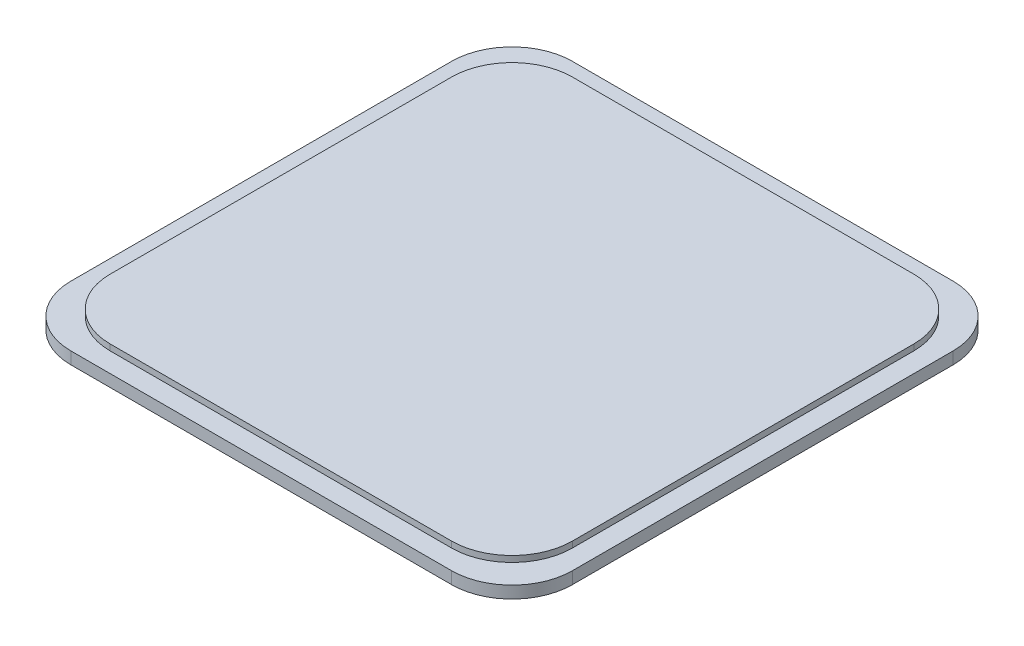
ISO-10303-21;
HEADER;
FILE_DESCRIPTION(('STEP AP214'),'2;1');
FILE_NAME('part.step','',(''),(''),'','','');
FILE_SCHEMA(('AUTOMOTIVE_DESIGN { 1 0 10303 214 1 1 1 1 }'));
ENDSEC;
DATA;
#1=APPLICATION_CONTEXT('core data for automotive mechanical design processes');
#2=APPLICATION_PROTOCOL_DEFINITION('international standard','automotive_design',2000,#1);
#3=PRODUCT_CONTEXT('',#1,'mechanical');
#4=PRODUCT('Part','Part','',(#3));
#5=PRODUCT_RELATED_PRODUCT_CATEGORY('part','',(#4));
#6=PRODUCT_DEFINITION_FORMATION('','',#4);
#7=PRODUCT_DEFINITION_CONTEXT('part definition',#1,'design');
#8=PRODUCT_DEFINITION('design','',#6,#7);
#9=PRODUCT_DEFINITION_SHAPE('','',#8);
#10=(LENGTH_UNIT() NAMED_UNIT(*) SI_UNIT(.MILLI.,.METRE.));
#11=(NAMED_UNIT(*) PLANE_ANGLE_UNIT() SI_UNIT($,.RADIAN.));
#12=(NAMED_UNIT(*) SI_UNIT($,.STERADIAN.) SOLID_ANGLE_UNIT());
#13=UNCERTAINTY_MEASURE_WITH_UNIT(LENGTH_MEASURE(1.E-05),#10,'distance_accuracy_value','');
#14=(GEOMETRIC_REPRESENTATION_CONTEXT(3) GLOBAL_UNCERTAINTY_ASSIGNED_CONTEXT((#13)) GLOBAL_UNIT_ASSIGNED_CONTEXT((#10,
#11,#12)) REPRESENTATION_CONTEXT('',''));
#15=CARTESIAN_POINT('',(0.,0.,0.));
#16=DIRECTION('',(0.,0.,1.));
#17=DIRECTION('',(1.,0.,0.));
#18=AXIS2_PLACEMENT_3D('',#15,#16,#17);
#19=CARTESIAN_POINT('',(31.5,2.,31.5));
#20=DIRECTION('',(0.,-1.,0.));
#21=DIRECTION('',(0.,0.,-1.));
#22=AXIS2_PLACEMENT_3D('',#19,#20,#21);
#23=CYLINDRICAL_SURFACE('',#22,10.);
#24=CARTESIAN_POINT('',(31.5,0.,31.5));
#25=DIRECTION('',(0.,1.,0.));
#26=DIRECTION('',(0.,0.,1.));
#27=AXIS2_PLACEMENT_3D('',#24,#25,#26);
#28=CIRCLE('',#27,10.);
#29=CARTESIAN_POINT('',(31.4999999999999,0.,41.5));
#30=VERTEX_POINT('',#29);
#31=CARTESIAN_POINT('',(41.5,0.,31.4999999999999));
#32=VERTEX_POINT('',#31);
#33=EDGE_CURVE('E175',#30,#32,#28,.T.);
#34=ORIENTED_EDGE('',*,*,#33,.T.);
#35=DIRECTION('',(0.,-1.,0.));
#36=VECTOR('',#35,1.);
#37=CARTESIAN_POINT('',(41.5,2.,31.4999999999999));
#38=LINE('',#37,#36);
#39=CARTESIAN_POINT('',(41.5,2.,31.4999999999999));
#40=VERTEX_POINT('',#39);
#41=EDGE_CURVE('E11',#40,#32,#38,.T.);
#42=ORIENTED_EDGE('',*,*,#41,.F.);
#43=CARTESIAN_POINT('',(31.5,2.,31.5));
#44=DIRECTION('',(0.,1.,0.));
#45=DIRECTION('',(0.,0.,1.));
#46=AXIS2_PLACEMENT_3D('',#43,#44,#45);
#47=CIRCLE('',#46,10.);
#48=CARTESIAN_POINT('',(31.4999999999999,2.,41.5));
#49=VERTEX_POINT('',#48);
#50=EDGE_CURVE('E186',#49,#40,#47,.T.);
#51=ORIENTED_EDGE('',*,*,#50,.F.);
#52=DIRECTION('',(0.,-1.,0.));
#53=VECTOR('',#52,1.);
#54=CARTESIAN_POINT('',(31.4999999999999,2.,41.5));
#55=LINE('',#54,#53);
#56=EDGE_CURVE('E211',#49,#30,#55,.T.);
#57=ORIENTED_EDGE('',*,*,#56,.T.);
#58=EDGE_LOOP('',(#34,#42,#51,#57));
#59=FACE_BOUND('',#58,.T.);
#60=ADVANCED_FACE('F39',(#59),#23,.T.);
#61=CARTESIAN_POINT('',(41.5,2.,-31.4999999999999));
#62=DIRECTION('',(-1.,0.,0.));
#63=DIRECTION('',(0.,0.,1.));
#64=AXIS2_PLACEMENT_3D('',#61,#62,#63);
#65=PLANE('',#64);
#66=DIRECTION('',(0.,0.,-1.));
#67=VECTOR('',#66,1.);
#68=CARTESIAN_POINT('',(41.5,0.,-31.4999999999999));
#69=LINE('',#68,#67);
#70=CARTESIAN_POINT('',(41.5,0.,-31.4999999999999));
#71=VERTEX_POINT('',#70);
#72=EDGE_CURVE('E180',#32,#71,#69,.T.);
#73=ORIENTED_EDGE('',*,*,#72,.T.);
#74=DIRECTION('',(0.,-1.,0.));
#75=VECTOR('',#74,1.);
#76=CARTESIAN_POINT('',(41.5,2.,-31.4999999999999));
#77=LINE('',#76,#75);
#78=CARTESIAN_POINT('',(41.5,2.,-31.4999999999999));
#79=VERTEX_POINT('',#78);
#80=EDGE_CURVE('E47',#79,#71,#77,.T.);
#81=ORIENTED_EDGE('',*,*,#80,.F.);
#82=DIRECTION('',(0.,0.,-1.));
#83=VECTOR('',#82,1.);
#84=CARTESIAN_POINT('',(41.5,2.,-31.4999999999999));
#85=LINE('',#84,#83);
#86=EDGE_CURVE('E190',#40,#79,#85,.T.);
#87=ORIENTED_EDGE('',*,*,#86,.F.);
#88=ORIENTED_EDGE('',*,*,#41,.T.);
#89=EDGE_LOOP('',(#73,#81,#87,#88));
#90=FACE_BOUND('',#89,.T.);
#91=ADVANCED_FACE('F283',(#90),#65,.F.);
#92=CARTESIAN_POINT('',(31.5,2.,-31.5));
#93=DIRECTION('',(0.,-1.,0.));
#94=DIRECTION('',(0.,0.,-1.));
#95=AXIS2_PLACEMENT_3D('',#92,#93,#94);
#96=CYLINDRICAL_SURFACE('',#95,10.);
#97=CARTESIAN_POINT('',(31.5,0.,-31.5));
#98=DIRECTION('',(0.,1.,0.));
#99=DIRECTION('',(0.,0.,-1.));
#100=AXIS2_PLACEMENT_3D('',#97,#98,#99);
#101=CIRCLE('',#100,10.);
#102=CARTESIAN_POINT('',(31.4999999999999,0.,-41.5));
#103=VERTEX_POINT('',#102);
#104=EDGE_CURVE('E215',#71,#103,#101,.T.);
#105=ORIENTED_EDGE('',*,*,#104,.T.);
#106=DIRECTION('',(0.,-1.,0.));
#107=VECTOR('',#106,1.);
#108=CARTESIAN_POINT('',(31.4999999999999,2.,-41.5));
#109=LINE('',#108,#107);
#110=CARTESIAN_POINT('',(31.4999999999999,2.,-41.5));
#111=VERTEX_POINT('',#110);
#112=EDGE_CURVE('E251',#111,#103,#109,.T.);
#113=ORIENTED_EDGE('',*,*,#112,.F.);
#114=CARTESIAN_POINT('',(31.5,2.,-31.5));
#115=DIRECTION('',(0.,1.,0.));
#116=DIRECTION('',(0.,0.,-1.));
#117=AXIS2_PLACEMENT_3D('',#114,#115,#116);
#118=CIRCLE('',#117,10.);
#119=EDGE_CURVE('E194',#79,#111,#118,.T.);
#120=ORIENTED_EDGE('',*,*,#119,.F.);
#121=ORIENTED_EDGE('',*,*,#80,.T.);
#122=EDGE_LOOP('',(#105,#113,#120,#121));
#123=FACE_BOUND('',#122,.T.);
#124=ADVANCED_FACE('F260',(#123),#96,.T.);
#125=CARTESIAN_POINT('',(-31.5,2.,-41.5));
#126=DIRECTION('',(0.,0.,1.));
#127=DIRECTION('',(1.,0.,0.));
#128=AXIS2_PLACEMENT_3D('',#125,#126,#127);
#129=PLANE('',#128);
#130=DIRECTION('',(-1.,0.,0.));
#131=VECTOR('',#130,1.);
#132=CARTESIAN_POINT('',(-31.5,0.,-41.5));
#133=LINE('',#132,#131);
#134=CARTESIAN_POINT('',(-31.5,0.,-41.5));
#135=VERTEX_POINT('',#134);
#136=EDGE_CURVE('E218',#103,#135,#133,.T.);
#137=ORIENTED_EDGE('',*,*,#136,.T.);
#138=DIRECTION('',(0.,-1.,0.));
#139=VECTOR('',#138,1.);
#140=CARTESIAN_POINT('',(-31.5,2.,-41.5));
#141=LINE('',#140,#139);
#142=CARTESIAN_POINT('',(-31.5,2.,-41.5));
#143=VERTEX_POINT('',#142);
#144=EDGE_CURVE('E247',#143,#135,#141,.T.);
#145=ORIENTED_EDGE('',*,*,#144,.F.);
#146=DIRECTION('',(-1.,0.,0.));
#147=VECTOR('',#146,1.);
#148=CARTESIAN_POINT('',(-31.5,2.,-41.5));
#149=LINE('',#148,#147);
#150=EDGE_CURVE('E197',#111,#143,#149,.T.);
#151=ORIENTED_EDGE('',*,*,#150,.F.);
#152=ORIENTED_EDGE('',*,*,#112,.T.);
#153=EDGE_LOOP('',(#137,#145,#151,#152));
#154=FACE_BOUND('',#153,.T.);
#155=ADVANCED_FACE('F271',(#154),#129,.F.);
#156=CARTESIAN_POINT('',(-31.5,2.,-31.5));
#157=DIRECTION('',(0.,-1.,0.));
#158=DIRECTION('',(0.,0.,-1.));
#159=AXIS2_PLACEMENT_3D('',#156,#157,#158);
#160=CYLINDRICAL_SURFACE('',#159,10.);
#161=CARTESIAN_POINT('',(-31.5,0.,-31.5));
#162=DIRECTION('',(0.,1.,0.));
#163=DIRECTION('',(0.,0.,1.));
#164=AXIS2_PLACEMENT_3D('',#161,#162,#163);
#165=CIRCLE('',#164,10.);
#166=CARTESIAN_POINT('',(-41.5,0.,-31.4999999999999));
#167=VERTEX_POINT('',#166);
#168=EDGE_CURVE('E221',#135,#167,#165,.T.);
#169=ORIENTED_EDGE('',*,*,#168,.T.);
#170=DIRECTION('',(0.,-1.,0.));
#171=VECTOR('',#170,1.);
#172=CARTESIAN_POINT('',(-41.5,2.,-31.4999999999999));
#173=LINE('',#172,#171);
#174=CARTESIAN_POINT('',(-41.5,2.,-31.4999999999999));
#175=VERTEX_POINT('',#174);
#176=EDGE_CURVE('E243',#175,#167,#173,.T.);
#177=ORIENTED_EDGE('',*,*,#176,.F.);
#178=CARTESIAN_POINT('',(-31.5,2.,-31.5));
#179=DIRECTION('',(0.,1.,0.));
#180=DIRECTION('',(0.,0.,1.));
#181=AXIS2_PLACEMENT_3D('',#178,#179,#180);
#182=CIRCLE('',#181,10.);
#183=EDGE_CURVE('E200',#143,#175,#182,.T.);
#184=ORIENTED_EDGE('',*,*,#183,.F.);
#185=ORIENTED_EDGE('',*,*,#144,.T.);
#186=EDGE_LOOP('',(#169,#177,#184,#185));
#187=FACE_BOUND('',#186,.T.);
#188=ADVANCED_FACE('F275',(#187),#160,.T.);
#189=CARTESIAN_POINT('',(-41.5,2.,-31.4999999999999));
#190=DIRECTION('',(1.,0.,0.));
#191=DIRECTION('',(0.,0.,-1.));
#192=AXIS2_PLACEMENT_3D('',#189,#190,#191);
#193=PLANE('',#192);
#194=DIRECTION('',(0.,0.,1.));
#195=VECTOR('',#194,1.);
#196=CARTESIAN_POINT('',(-41.5,0.,-31.4999999999999));
#197=LINE('',#196,#195);
#198=CARTESIAN_POINT('',(-41.5,0.,31.4999999999999));
#199=VERTEX_POINT('',#198);
#200=EDGE_CURVE('E224',#167,#199,#197,.T.);
#201=ORIENTED_EDGE('',*,*,#200,.T.);
#202=DIRECTION('',(0.,-1.,0.));
#203=VECTOR('',#202,1.);
#204=CARTESIAN_POINT('',(-41.5,2.,31.4999999999999));
#205=LINE('',#204,#203);
#206=CARTESIAN_POINT('',(-41.5,2.,31.4999999999999));
#207=VERTEX_POINT('',#206);
#208=EDGE_CURVE('E239',#207,#199,#205,.T.);
#209=ORIENTED_EDGE('',*,*,#208,.F.);
#210=DIRECTION('',(0.,0.,1.));
#211=VECTOR('',#210,1.);
#212=CARTESIAN_POINT('',(-41.5,2.,-31.4999999999999));
#213=LINE('',#212,#211);
#214=EDGE_CURVE('E203',#175,#207,#213,.T.);
#215=ORIENTED_EDGE('',*,*,#214,.F.);
#216=ORIENTED_EDGE('',*,*,#176,.T.);
#217=EDGE_LOOP('',(#201,#209,#215,#216));
#218=FACE_BOUND('',#217,.T.);
#219=ADVANCED_FACE('F296',(#218),#193,.F.);
#220=CARTESIAN_POINT('',(-31.5,2.,31.5));
#221=DIRECTION('',(0.,-1.,0.));
#222=DIRECTION('',(0.,0.,-1.));
#223=AXIS2_PLACEMENT_3D('',#220,#221,#222);
#224=CYLINDRICAL_SURFACE('',#223,10.);
#225=CARTESIAN_POINT('',(-31.5,0.,31.5));
#226=DIRECTION('',(0.,1.,0.));
#227=DIRECTION('',(0.,0.,1.));
#228=AXIS2_PLACEMENT_3D('',#225,#226,#227);
#229=CIRCLE('',#228,10.);
#230=CARTESIAN_POINT('',(-31.4999999999999,0.,41.5));
#231=VERTEX_POINT('',#230);
#232=EDGE_CURVE('E227',#199,#231,#229,.T.);
#233=ORIENTED_EDGE('',*,*,#232,.T.);
#234=DIRECTION('',(0.,-1.,0.));
#235=VECTOR('',#234,1.);
#236=CARTESIAN_POINT('',(-31.4999999999999,2.,41.5));
#237=LINE('',#236,#235);
#238=CARTESIAN_POINT('',(-31.4999999999999,2.,41.5));
#239=VERTEX_POINT('',#238);
#240=EDGE_CURVE('E235',#239,#231,#237,.T.);
#241=ORIENTED_EDGE('',*,*,#240,.F.);
#242=CARTESIAN_POINT('',(-31.5,2.,31.5));
#243=DIRECTION('',(0.,1.,0.));
#244=DIRECTION('',(0.,0.,1.));
#245=AXIS2_PLACEMENT_3D('',#242,#243,#244);
#246=CIRCLE('',#245,10.);
#247=EDGE_CURVE('E206',#207,#239,#246,.T.);
#248=ORIENTED_EDGE('',*,*,#247,.F.);
#249=ORIENTED_EDGE('',*,*,#208,.T.);
#250=EDGE_LOOP('',(#233,#241,#248,#249));
#251=FACE_BOUND('',#250,.T.);
#252=ADVANCED_FACE('F294',(#251),#224,.T.);
#253=CARTESIAN_POINT('',(-31.4999999999999,2.,41.5));
#254=DIRECTION('',(0.,0.,-1.));
#255=DIRECTION('',(-1.,0.,0.));
#256=AXIS2_PLACEMENT_3D('',#253,#254,#255);
#257=PLANE('',#256);
#258=DIRECTION('',(1.,0.,0.));
#259=VECTOR('',#258,1.);
#260=CARTESIAN_POINT('',(-31.4999999999999,0.,41.5));
#261=LINE('',#260,#259);
#262=EDGE_CURVE('E191',#231,#30,#261,.T.);
#263=ORIENTED_EDGE('',*,*,#262,.T.);
#264=ORIENTED_EDGE('',*,*,#56,.F.);
#265=DIRECTION('',(1.,0.,0.));
#266=VECTOR('',#265,1.);
#267=CARTESIAN_POINT('',(-31.4999999999999,2.,41.5));
#268=LINE('',#267,#266);
#269=EDGE_CURVE('E209',#239,#49,#268,.T.);
#270=ORIENTED_EDGE('',*,*,#269,.F.);
#271=ORIENTED_EDGE('',*,*,#240,.T.);
#272=EDGE_LOOP('',(#263,#264,#270,#271));
#273=FACE_BOUND('',#272,.T.);
#274=ADVANCED_FACE('F289',(#273),#257,.F.);
#275=CARTESIAN_POINT('',(31.5,2.,31.5));
#276=DIRECTION('',(0.,1.,0.));
#277=DIRECTION('',(0.,0.,1.));
#278=AXIS2_PLACEMENT_3D('',#275,#276,#277);
#279=PLANE('',#278);
#280=CARTESIAN_POINT('',(-28.25,2.,28.25));
#281=DIRECTION('',(0.,1.,0.));
#282=DIRECTION('',(0.,0.,1.));
#283=AXIS2_PLACEMENT_3D('',#280,#281,#282);
#284=CIRCLE('',#283,10.);
#285=CARTESIAN_POINT('',(-38.25,2.,28.2499999999999));
#286=VERTEX_POINT('',#285);
#287=CARTESIAN_POINT('',(-28.2499999999999,2.,38.25));
#288=VERTEX_POINT('',#287);
#289=EDGE_CURVE('E54',#286,#288,#284,.T.);
#290=ORIENTED_EDGE('',*,*,#289,.F.);
#291=DIRECTION('',(0.,0.,1.));
#292=VECTOR('',#291,1.);
#293=CARTESIAN_POINT('',(-38.25,2.,-28.2499999999999));
#294=LINE('',#293,#292);
#295=CARTESIAN_POINT('',(-38.25,2.,-28.2499999999999));
#296=VERTEX_POINT('',#295);
#297=EDGE_CURVE('E58',#296,#286,#294,.T.);
#298=ORIENTED_EDGE('',*,*,#297,.F.);
#299=CARTESIAN_POINT('',(-28.25,2.,-28.25));
#300=DIRECTION('',(0.,1.,0.));
#301=DIRECTION('',(0.,0.,1.));
#302=AXIS2_PLACEMENT_3D('',#299,#300,#301);
#303=CIRCLE('',#302,10.);
#304=CARTESIAN_POINT('',(-28.2499999999999,2.,-38.25));
#305=VERTEX_POINT('',#304);
#306=EDGE_CURVE('E450',#305,#296,#303,.T.);
#307=ORIENTED_EDGE('',*,*,#306,.F.);
#308=DIRECTION('',(-1.,0.,0.));
#309=VECTOR('',#308,1.);
#310=CARTESIAN_POINT('',(-28.2499999999999,2.,-38.25));
#311=LINE('',#310,#309);
#312=CARTESIAN_POINT('',(28.2499999999999,2.,-38.25));
#313=VERTEX_POINT('',#312);
#314=EDGE_CURVE('E495',#313,#305,#311,.T.);
#315=ORIENTED_EDGE('',*,*,#314,.F.);
#316=CARTESIAN_POINT('',(28.25,2.,-28.25));
#317=DIRECTION('',(0.,1.,0.));
#318=DIRECTION('',(0.,0.,-1.));
#319=AXIS2_PLACEMENT_3D('',#316,#317,#318);
#320=CIRCLE('',#319,10.);
#321=CARTESIAN_POINT('',(38.25,2.,-28.2499999999999));
#322=VERTEX_POINT('',#321);
#323=EDGE_CURVE('E487',#322,#313,#320,.T.);
#324=ORIENTED_EDGE('',*,*,#323,.F.);
#325=DIRECTION('',(0.,0.,-1.));
#326=VECTOR('',#325,1.);
#327=CARTESIAN_POINT('',(38.25,2.,-28.2499999999999));
#328=LINE('',#327,#326);
#329=CARTESIAN_POINT('',(38.25,2.,28.2499999999999));
#330=VERTEX_POINT('',#329);
#331=EDGE_CURVE('E478',#330,#322,#328,.T.);
#332=ORIENTED_EDGE('',*,*,#331,.F.);
#333=CARTESIAN_POINT('',(28.25,2.,28.25));
#334=DIRECTION('',(0.,1.,0.));
#335=DIRECTION('',(0.,0.,1.));
#336=AXIS2_PLACEMENT_3D('',#333,#334,#335);
#337=CIRCLE('',#336,10.);
#338=CARTESIAN_POINT('',(28.2499999999999,2.,38.25));
#339=VERTEX_POINT('',#338);
#340=EDGE_CURVE('E481',#339,#330,#337,.T.);
#341=ORIENTED_EDGE('',*,*,#340,.F.);
#342=DIRECTION('',(1.,0.,0.));
#343=VECTOR('',#342,1.);
#344=CARTESIAN_POINT('',(-28.2499999999999,2.,38.25));
#345=LINE('',#344,#343);
#346=EDGE_CURVE('E483',#288,#339,#345,.T.);
#347=ORIENTED_EDGE('',*,*,#346,.F.);
#348=EDGE_LOOP('',(#290,#298,#307,#315,#324,#332,#341,#347));
#349=FACE_BOUND('',#348,.T.);
#350=ORIENTED_EDGE('',*,*,#50,.T.);
#351=ORIENTED_EDGE('',*,*,#86,.T.);
#352=ORIENTED_EDGE('',*,*,#119,.T.);
#353=ORIENTED_EDGE('',*,*,#150,.T.);
#354=ORIENTED_EDGE('',*,*,#183,.T.);
#355=ORIENTED_EDGE('',*,*,#214,.T.);
#356=ORIENTED_EDGE('',*,*,#247,.T.);
#357=ORIENTED_EDGE('',*,*,#269,.T.);
#358=EDGE_LOOP('',(#350,#351,#352,#353,#354,#355,#356,#357));
#359=FACE_BOUND('',#358,.T.);
#360=ADVANCED_FACE('F279',(#349,#359),#279,.T.);
#361=CARTESIAN_POINT('',(31.5,0.,31.5));
#362=DIRECTION('',(0.,1.,0.));
#363=DIRECTION('',(0.,0.,1.));
#364=AXIS2_PLACEMENT_3D('',#361,#362,#363);
#365=PLANE('',#364);
#366=ORIENTED_EDGE('',*,*,#33,.F.);
#367=ORIENTED_EDGE('',*,*,#262,.F.);
#368=ORIENTED_EDGE('',*,*,#232,.F.);
#369=ORIENTED_EDGE('',*,*,#200,.F.);
#370=ORIENTED_EDGE('',*,*,#168,.F.);
#371=ORIENTED_EDGE('',*,*,#136,.F.);
#372=ORIENTED_EDGE('',*,*,#104,.F.);
#373=ORIENTED_EDGE('',*,*,#72,.F.);
#374=EDGE_LOOP('',(#366,#367,#368,#369,#370,#371,#372,#373));
#375=FACE_BOUND('',#374,.T.);
#376=ADVANCED_FACE('F266',(#375),#365,.F.);
#377=CARTESIAN_POINT('',(-28.25,3.,28.25));
#378=DIRECTION('',(0.,-1.,0.));
#379=DIRECTION('',(0.,0.,-1.));
#380=AXIS2_PLACEMENT_3D('',#377,#378,#379);
#381=CYLINDRICAL_SURFACE('',#380,10.);
#382=ORIENTED_EDGE('',*,*,#289,.T.);
#383=DIRECTION('',(0.,-1.,0.));
#384=VECTOR('',#383,1.);
#385=CARTESIAN_POINT('',(-28.2499999999999,3.,38.25));
#386=LINE('',#385,#384);
#387=CARTESIAN_POINT('',(-28.2499999999999,3.,38.25));
#388=VERTEX_POINT('',#387);
#389=EDGE_CURVE('E155',#388,#288,#386,.T.);
#390=ORIENTED_EDGE('',*,*,#389,.F.);
#391=CARTESIAN_POINT('',(-28.25,3.,28.25));
#392=DIRECTION('',(0.,1.,0.));
#393=DIRECTION('',(0.,0.,1.));
#394=AXIS2_PLACEMENT_3D('',#391,#392,#393);
#395=CIRCLE('',#394,10.);
#396=CARTESIAN_POINT('',(-38.25,3.,28.2499999999999));
#397=VERTEX_POINT('',#396);
#398=EDGE_CURVE('E162',#397,#388,#395,.T.);
#399=ORIENTED_EDGE('',*,*,#398,.F.);
#400=DIRECTION('',(0.,-1.,0.));
#401=VECTOR('',#400,1.);
#402=CARTESIAN_POINT('',(-38.25,3.,28.2499999999999));
#403=LINE('',#402,#401);
#404=EDGE_CURVE('E446',#397,#286,#403,.T.);
#405=ORIENTED_EDGE('',*,*,#404,.T.);
#406=EDGE_LOOP('',(#382,#390,#399,#405));
#407=FACE_BOUND('',#406,.T.);
#408=ADVANCED_FACE('F173',(#407),#381,.T.);
#409=CARTESIAN_POINT('',(-28.2499999999999,3.,38.25));
#410=DIRECTION('',(0.,0.,-1.));
#411=DIRECTION('',(-1.,0.,0.));
#412=AXIS2_PLACEMENT_3D('',#409,#410,#411);
#413=PLANE('',#412);
#414=ORIENTED_EDGE('',*,*,#346,.T.);
#415=DIRECTION('',(0.,-1.,0.));
#416=VECTOR('',#415,1.);
#417=CARTESIAN_POINT('',(28.2499999999999,3.,38.25));
#418=LINE('',#417,#416);
#419=CARTESIAN_POINT('',(28.2499999999999,3.,38.25));
#420=VERTEX_POINT('',#419);
#421=EDGE_CURVE('E157',#420,#339,#418,.T.);
#422=ORIENTED_EDGE('',*,*,#421,.F.);
#423=DIRECTION('',(1.,0.,0.));
#424=VECTOR('',#423,1.);
#425=CARTESIAN_POINT('',(-28.2499999999999,3.,38.25));
#426=LINE('',#425,#424);
#427=EDGE_CURVE('E150',#388,#420,#426,.T.);
#428=ORIENTED_EDGE('',*,*,#427,.F.);
#429=ORIENTED_EDGE('',*,*,#389,.T.);
#430=EDGE_LOOP('',(#414,#422,#428,#429));
#431=FACE_BOUND('',#430,.T.);
#432=ADVANCED_FACE('F153',(#431),#413,.F.);
#433=CARTESIAN_POINT('',(28.25,3.,28.25));
#434=DIRECTION('',(0.,-1.,0.));
#435=DIRECTION('',(0.,0.,-1.));
#436=AXIS2_PLACEMENT_3D('',#433,#434,#435);
#437=CYLINDRICAL_SURFACE('',#436,10.);
#438=ORIENTED_EDGE('',*,*,#340,.T.);
#439=DIRECTION('',(0.,-1.,0.));
#440=VECTOR('',#439,1.);
#441=CARTESIAN_POINT('',(38.25,3.,28.2499999999999));
#442=LINE('',#441,#440);
#443=CARTESIAN_POINT('',(38.25,3.,28.2499999999999));
#444=VERTEX_POINT('',#443);
#445=EDGE_CURVE('E182',#444,#330,#442,.T.);
#446=ORIENTED_EDGE('',*,*,#445,.F.);
#447=CARTESIAN_POINT('',(28.25,3.,28.25));
#448=DIRECTION('',(0.,1.,0.));
#449=DIRECTION('',(0.,0.,1.));
#450=AXIS2_PLACEMENT_3D('',#447,#448,#449);
#451=CIRCLE('',#450,10.);
#452=EDGE_CURVE('E161',#420,#444,#451,.T.);
#453=ORIENTED_EDGE('',*,*,#452,.F.);
#454=ORIENTED_EDGE('',*,*,#421,.T.);
#455=EDGE_LOOP('',(#438,#446,#453,#454));
#456=FACE_BOUND('',#455,.T.);
#457=ADVANCED_FACE('F374',(#456),#437,.T.);
#458=CARTESIAN_POINT('',(38.25,3.,-28.2499999999999));
#459=DIRECTION('',(-1.,0.,0.));
#460=DIRECTION('',(0.,0.,1.));
#461=AXIS2_PLACEMENT_3D('',#458,#459,#460);
#462=PLANE('',#461);
#463=ORIENTED_EDGE('',*,*,#331,.T.);
#464=DIRECTION('',(0.,-1.,0.));
#465=VECTOR('',#464,1.);
#466=CARTESIAN_POINT('',(38.25,3.,-28.2499999999999));
#467=LINE('',#466,#465);
#468=CARTESIAN_POINT('',(38.25,3.,-28.2499999999999));
#469=VERTEX_POINT('',#468);
#470=EDGE_CURVE('E469',#469,#322,#467,.T.);
#471=ORIENTED_EDGE('',*,*,#470,.F.);
#472=DIRECTION('',(0.,0.,-1.));
#473=VECTOR('',#472,1.);
#474=CARTESIAN_POINT('',(38.25,3.,-28.2499999999999));
#475=LINE('',#474,#473);
#476=EDGE_CURVE('E479',#444,#469,#475,.T.);
#477=ORIENTED_EDGE('',*,*,#476,.F.);
#478=ORIENTED_EDGE('',*,*,#445,.T.);
#479=EDGE_LOOP('',(#463,#471,#477,#478));
#480=FACE_BOUND('',#479,.T.);
#481=ADVANCED_FACE('F383',(#480),#462,.F.);
#482=CARTESIAN_POINT('',(28.25,3.,-28.25));
#483=DIRECTION('',(0.,-1.,0.));
#484=DIRECTION('',(0.,0.,-1.));
#485=AXIS2_PLACEMENT_3D('',#482,#483,#484);
#486=CYLINDRICAL_SURFACE('',#485,10.);
#487=ORIENTED_EDGE('',*,*,#323,.T.);
#488=DIRECTION('',(0.,-1.,0.));
#489=VECTOR('',#488,1.);
#490=CARTESIAN_POINT('',(28.2499999999999,3.,-38.25));
#491=LINE('',#490,#489);
#492=CARTESIAN_POINT('',(28.2499999999999,3.,-38.25));
#493=VERTEX_POINT('',#492);
#494=EDGE_CURVE('E465',#493,#313,#491,.T.);
#495=ORIENTED_EDGE('',*,*,#494,.F.);
#496=CARTESIAN_POINT('',(28.25,3.,-28.25));
#497=DIRECTION('',(0.,1.,0.));
#498=DIRECTION('',(0.,0.,-1.));
#499=AXIS2_PLACEMENT_3D('',#496,#497,#498);
#500=CIRCLE('',#499,10.);
#501=EDGE_CURVE('E505',#469,#493,#500,.T.);
#502=ORIENTED_EDGE('',*,*,#501,.F.);
#503=ORIENTED_EDGE('',*,*,#470,.T.);
#504=EDGE_LOOP('',(#487,#495,#502,#503));
#505=FACE_BOUND('',#504,.T.);
#506=ADVANCED_FACE('F393',(#505),#486,.T.);
#507=CARTESIAN_POINT('',(-28.2499999999999,3.,-38.25));
#508=DIRECTION('',(0.,0.,1.));
#509=DIRECTION('',(1.,0.,0.));
#510=AXIS2_PLACEMENT_3D('',#507,#508,#509);
#511=PLANE('',#510);
#512=ORIENTED_EDGE('',*,*,#314,.T.);
#513=DIRECTION('',(0.,-1.,0.));
#514=VECTOR('',#513,1.);
#515=CARTESIAN_POINT('',(-28.2499999999999,3.,-38.25));
#516=LINE('',#515,#514);
#517=CARTESIAN_POINT('',(-28.2499999999999,3.,-38.25));
#518=VERTEX_POINT('',#517);
#519=EDGE_CURVE('E456',#518,#305,#516,.T.);
#520=ORIENTED_EDGE('',*,*,#519,.F.);
#521=DIRECTION('',(-1.,0.,0.));
#522=VECTOR('',#521,1.);
#523=CARTESIAN_POINT('',(-28.2499999999999,3.,-38.25));
#524=LINE('',#523,#522);
#525=EDGE_CURVE('E503',#493,#518,#524,.T.);
#526=ORIENTED_EDGE('',*,*,#525,.F.);
#527=ORIENTED_EDGE('',*,*,#494,.T.);
#528=EDGE_LOOP('',(#512,#520,#526,#527));
#529=FACE_BOUND('',#528,.T.);
#530=ADVANCED_FACE('F403',(#529),#511,.F.);
#531=CARTESIAN_POINT('',(-28.25,3.,-28.25));
#532=DIRECTION('',(0.,-1.,0.));
#533=DIRECTION('',(0.,0.,-1.));
#534=AXIS2_PLACEMENT_3D('',#531,#532,#533);
#535=CYLINDRICAL_SURFACE('',#534,10.);
#536=ORIENTED_EDGE('',*,*,#306,.T.);
#537=DIRECTION('',(0.,-1.,0.));
#538=VECTOR('',#537,1.);
#539=CARTESIAN_POINT('',(-38.25,3.,-28.2499999999999));
#540=LINE('',#539,#538);
#541=CARTESIAN_POINT('',(-38.25,3.,-28.2499999999999));
#542=VERTEX_POINT('',#541);
#543=EDGE_CURVE('E448',#542,#296,#540,.T.);
#544=ORIENTED_EDGE('',*,*,#543,.F.);
#545=CARTESIAN_POINT('',(-28.25,3.,-28.25));
#546=DIRECTION('',(0.,1.,0.));
#547=DIRECTION('',(0.,0.,1.));
#548=AXIS2_PLACEMENT_3D('',#545,#546,#547);
#549=CIRCLE('',#548,10.);
#550=EDGE_CURVE('E458',#518,#542,#549,.T.);
#551=ORIENTED_EDGE('',*,*,#550,.F.);
#552=ORIENTED_EDGE('',*,*,#519,.T.);
#553=EDGE_LOOP('',(#536,#544,#551,#552));
#554=FACE_BOUND('',#553,.T.);
#555=ADVANCED_FACE('F413',(#554),#535,.T.);
#556=CARTESIAN_POINT('',(-38.25,3.,-28.2499999999999));
#557=DIRECTION('',(1.,0.,0.));
#558=DIRECTION('',(0.,0.,-1.));
#559=AXIS2_PLACEMENT_3D('',#556,#557,#558);
#560=PLANE('',#559);
#561=ORIENTED_EDGE('',*,*,#297,.T.);
#562=ORIENTED_EDGE('',*,*,#404,.F.);
#563=DIRECTION('',(0.,0.,1.));
#564=VECTOR('',#563,1.);
#565=CARTESIAN_POINT('',(-38.25,3.,-28.2499999999999));
#566=LINE('',#565,#564);
#567=EDGE_CURVE('E167',#542,#397,#566,.T.);
#568=ORIENTED_EDGE('',*,*,#567,.F.);
#569=ORIENTED_EDGE('',*,*,#543,.T.);
#570=EDGE_LOOP('',(#561,#562,#568,#569));
#571=FACE_BOUND('',#570,.T.);
#572=ADVANCED_FACE('F423',(#571),#560,.F.);
#573=CARTESIAN_POINT('',(-28.25,3.,28.25));
#574=DIRECTION('',(0.,1.,0.));
#575=DIRECTION('',(0.,0.,1.));
#576=AXIS2_PLACEMENT_3D('',#573,#574,#575);
#577=PLANE('',#576);
#578=ORIENTED_EDGE('',*,*,#398,.T.);
#579=ORIENTED_EDGE('',*,*,#427,.T.);
#580=ORIENTED_EDGE('',*,*,#452,.T.);
#581=ORIENTED_EDGE('',*,*,#476,.T.);
#582=ORIENTED_EDGE('',*,*,#501,.T.);
#583=ORIENTED_EDGE('',*,*,#525,.T.);
#584=ORIENTED_EDGE('',*,*,#550,.T.);
#585=ORIENTED_EDGE('',*,*,#567,.T.);
#586=EDGE_LOOP('',(#578,#579,#580,#581,#582,#583,#584,#585));
#587=FACE_BOUND('',#586,.T.);
#588=ADVANCED_FACE('F165',(#587),#577,.T.);
#589=CLOSED_SHELL('',(#60,#91,#124,#155,#188,#219,#252,#274,#360,#376,#408,#432,#457,#481,#506,
#530,#555,#572,#588));
#590=MANIFOLD_SOLID_BREP('B2',#589);
#591=ADVANCED_BREP_SHAPE_REPRESENTATION('',(#18,#590),#14);
#592=SHAPE_DEFINITION_REPRESENTATION(#9,#591);
ENDSEC;
END-ISO-10303-21;
